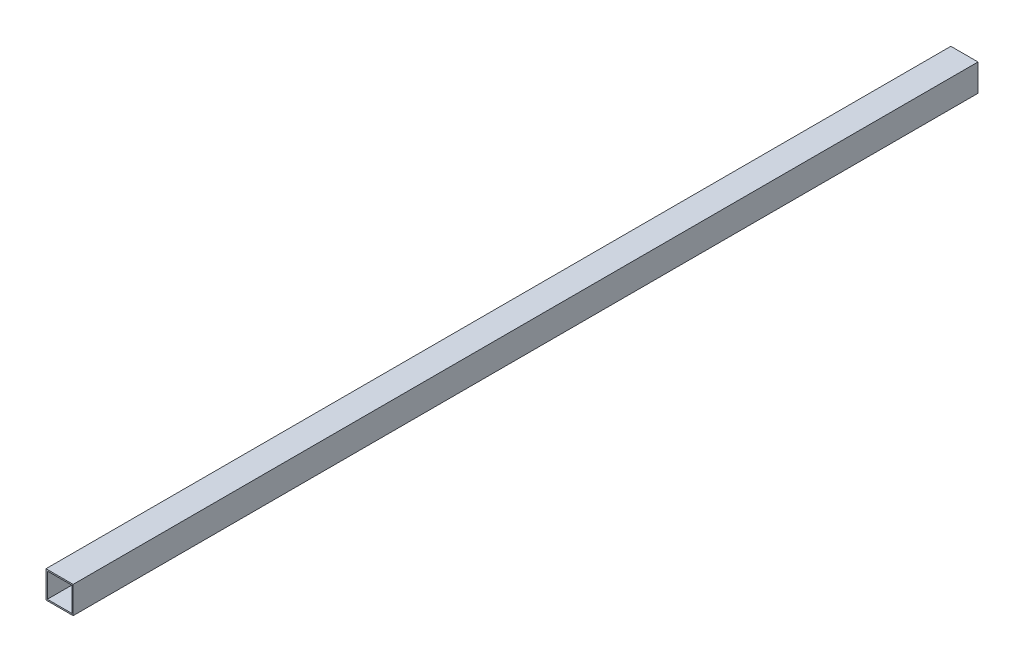
ISO-10303-21;
HEADER;
FILE_DESCRIPTION(('STEP AP214'),'2;1');
FILE_NAME('part.step','',(''),(''),'','','');
FILE_SCHEMA(('AUTOMOTIVE_DESIGN { 1 0 10303 214 1 1 1 1 }'));
ENDSEC;
DATA;
#1=APPLICATION_CONTEXT('core data for automotive mechanical design processes');
#2=APPLICATION_PROTOCOL_DEFINITION('international standard','automotive_design',2000,#1);
#3=PRODUCT_CONTEXT('',#1,'mechanical');
#4=PRODUCT('Part','Part','',(#3));
#5=PRODUCT_RELATED_PRODUCT_CATEGORY('part','',(#4));
#6=PRODUCT_DEFINITION_FORMATION('','',#4);
#7=PRODUCT_DEFINITION_CONTEXT('part definition',#1,'design');
#8=PRODUCT_DEFINITION('design','',#6,#7);
#9=PRODUCT_DEFINITION_SHAPE('','',#8);
#10=(LENGTH_UNIT() NAMED_UNIT(*) SI_UNIT(.MILLI.,.METRE.));
#11=(NAMED_UNIT(*) PLANE_ANGLE_UNIT() SI_UNIT($,.RADIAN.));
#12=(NAMED_UNIT(*) SI_UNIT($,.STERADIAN.) SOLID_ANGLE_UNIT());
#13=UNCERTAINTY_MEASURE_WITH_UNIT(LENGTH_MEASURE(1.E-05),#10,'distance_accuracy_value','');
#14=(GEOMETRIC_REPRESENTATION_CONTEXT(3) GLOBAL_UNCERTAINTY_ASSIGNED_CONTEXT((#13)) GLOBAL_UNIT_ASSIGNED_CONTEXT((#10,
#11,#12)) REPRESENTATION_CONTEXT('',''));
#15=CARTESIAN_POINT('',(0.,0.,0.));
#16=DIRECTION('',(0.,0.,1.));
#17=DIRECTION('',(1.,0.,0.));
#18=AXIS2_PLACEMENT_3D('',#15,#16,#17);
#19=CARTESIAN_POINT('',(0.,0.,1000.));
#20=DIRECTION('',(0.,0.,1.));
#21=DIRECTION('',(1.,0.,0.));
#22=AXIS2_PLACEMENT_3D('',#19,#20,#21);
#23=PLANE('',#22);
#24=DIRECTION('',(0.,1.,0.));
#25=VECTOR('',#24,1.);
#26=CARTESIAN_POINT('',(15.,15.,1000.));
#27=LINE('',#26,#25);
#28=CARTESIAN_POINT('',(15.,-15.,1000.));
#29=VERTEX_POINT('',#28);
#30=CARTESIAN_POINT('',(15.,15.,1000.));
#31=VERTEX_POINT('',#30);
#32=EDGE_CURVE('E138',#29,#31,#27,.T.);
#33=ORIENTED_EDGE('',*,*,#32,.T.);
#34=DIRECTION('',(-1.,0.,0.));
#35=VECTOR('',#34,1.);
#36=CARTESIAN_POINT('',(-15.,15.,1000.));
#37=LINE('',#36,#35);
#38=CARTESIAN_POINT('',(-15.,15.,1000.));
#39=VERTEX_POINT('',#38);
#40=EDGE_CURVE('E141',#31,#39,#37,.T.);
#41=ORIENTED_EDGE('',*,*,#40,.T.);
#42=DIRECTION('',(0.,-1.,0.));
#43=VECTOR('',#42,1.);
#44=CARTESIAN_POINT('',(-15.,15.,1000.));
#45=LINE('',#44,#43);
#46=CARTESIAN_POINT('',(-15.,-15.,1000.));
#47=VERTEX_POINT('',#46);
#48=EDGE_CURVE('E144',#39,#47,#45,.T.);
#49=ORIENTED_EDGE('',*,*,#48,.T.);
#50=DIRECTION('',(1.,0.,0.));
#51=VECTOR('',#50,1.);
#52=CARTESIAN_POINT('',(-15.,-15.,1000.));
#53=LINE('',#52,#51);
#54=EDGE_CURVE('E146',#47,#29,#53,.T.);
#55=ORIENTED_EDGE('',*,*,#54,.T.);
#56=EDGE_LOOP('',(#33,#41,#49,#55));
#57=FACE_BOUND('',#56,.T.);
#58=DIRECTION('',(0.,-1.,0.));
#59=VECTOR('',#58,1.);
#60=CARTESIAN_POINT('',(-13.5,13.5,1000.));
#61=LINE('',#60,#59);
#62=CARTESIAN_POINT('',(-13.5,13.5,1000.));
#63=VERTEX_POINT('',#62);
#64=CARTESIAN_POINT('',(-13.5,-13.5,1000.));
#65=VERTEX_POINT('',#64);
#66=EDGE_CURVE('E110',#63,#65,#61,.T.);
#67=ORIENTED_EDGE('',*,*,#66,.F.);
#68=DIRECTION('',(-1.,0.,0.));
#69=VECTOR('',#68,1.);
#70=CARTESIAN_POINT('',(-13.5,13.5,1000.));
#71=LINE('',#70,#69);
#72=CARTESIAN_POINT('',(13.5,13.5,1000.));
#73=VERTEX_POINT('',#72);
#74=EDGE_CURVE('E102',#73,#63,#71,.T.);
#75=ORIENTED_EDGE('',*,*,#74,.F.);
#76=DIRECTION('',(0.,1.,0.));
#77=VECTOR('',#76,1.);
#78=CARTESIAN_POINT('',(13.5,13.5,1000.));
#79=LINE('',#78,#77);
#80=CARTESIAN_POINT('',(13.5,-13.5,1000.));
#81=VERTEX_POINT('',#80);
#82=EDGE_CURVE('E124',#81,#73,#79,.T.);
#83=ORIENTED_EDGE('',*,*,#82,.F.);
#84=DIRECTION('',(1.,0.,0.));
#85=VECTOR('',#84,1.);
#86=CARTESIAN_POINT('',(-13.5,-13.5,1000.));
#87=LINE('',#86,#85);
#88=EDGE_CURVE('E122',#65,#81,#87,.T.);
#89=ORIENTED_EDGE('',*,*,#88,.F.);
#90=EDGE_LOOP('',(#67,#75,#83,#89));
#91=FACE_BOUND('',#90,.T.);
#92=ADVANCED_FACE('F37',(#57,#91),#23,.T.);
#93=CARTESIAN_POINT('',(0.,0.,0.));
#94=DIRECTION('',(0.,0.,1.));
#95=DIRECTION('',(1.,0.,0.));
#96=AXIS2_PLACEMENT_3D('',#93,#94,#95);
#97=PLANE('',#96);
#98=DIRECTION('',(0.,1.,0.));
#99=VECTOR('',#98,1.);
#100=CARTESIAN_POINT('',(15.,15.,0.));
#101=LINE('',#100,#99);
#102=CARTESIAN_POINT('',(15.,-15.,0.));
#103=VERTEX_POINT('',#102);
#104=CARTESIAN_POINT('',(15.,15.,0.));
#105=VERTEX_POINT('',#104);
#106=EDGE_CURVE('E118',#103,#105,#101,.T.);
#107=ORIENTED_EDGE('',*,*,#106,.F.);
#108=DIRECTION('',(1.,0.,0.));
#109=VECTOR('',#108,1.);
#110=CARTESIAN_POINT('',(-15.,-15.,0.));
#111=LINE('',#110,#109);
#112=CARTESIAN_POINT('',(-15.,-15.,0.));
#113=VERTEX_POINT('',#112);
#114=EDGE_CURVE('E142',#113,#103,#111,.T.);
#115=ORIENTED_EDGE('',*,*,#114,.F.);
#116=DIRECTION('',(0.,-1.,0.));
#117=VECTOR('',#116,1.);
#118=CARTESIAN_POINT('',(-15.,15.,0.));
#119=LINE('',#118,#117);
#120=CARTESIAN_POINT('',(-15.,15.,0.));
#121=VERTEX_POINT('',#120);
#122=EDGE_CURVE('E153',#121,#113,#119,.T.);
#123=ORIENTED_EDGE('',*,*,#122,.F.);
#124=DIRECTION('',(-1.,0.,0.));
#125=VECTOR('',#124,1.);
#126=CARTESIAN_POINT('',(-15.,15.,0.));
#127=LINE('',#126,#125);
#128=EDGE_CURVE('E151',#105,#121,#127,.T.);
#129=ORIENTED_EDGE('',*,*,#128,.F.);
#130=EDGE_LOOP('',(#107,#115,#123,#129));
#131=FACE_BOUND('',#130,.T.);
#132=DIRECTION('',(-1.,0.,0.));
#133=VECTOR('',#132,1.);
#134=CARTESIAN_POINT('',(-13.5,13.5,0.));
#135=LINE('',#134,#133);
#136=CARTESIAN_POINT('',(13.5,13.5,0.));
#137=VERTEX_POINT('',#136);
#138=CARTESIAN_POINT('',(-13.5,13.5,0.));
#139=VERTEX_POINT('',#138);
#140=EDGE_CURVE('E60',#137,#139,#135,.T.);
#141=ORIENTED_EDGE('',*,*,#140,.T.);
#142=DIRECTION('',(0.,-1.,0.));
#143=VECTOR('',#142,1.);
#144=CARTESIAN_POINT('',(-13.5,13.5,0.));
#145=LINE('',#144,#143);
#146=CARTESIAN_POINT('',(-13.5,-13.5,0.));
#147=VERTEX_POINT('',#146);
#148=EDGE_CURVE('E117',#139,#147,#145,.T.);
#149=ORIENTED_EDGE('',*,*,#148,.T.);
#150=DIRECTION('',(1.,0.,0.));
#151=VECTOR('',#150,1.);
#152=CARTESIAN_POINT('',(-13.5,-13.5,0.));
#153=LINE('',#152,#151);
#154=CARTESIAN_POINT('',(13.5,-13.5,0.));
#155=VERTEX_POINT('',#154);
#156=EDGE_CURVE('E130',#147,#155,#153,.T.);
#157=ORIENTED_EDGE('',*,*,#156,.T.);
#158=DIRECTION('',(0.,1.,0.));
#159=VECTOR('',#158,1.);
#160=CARTESIAN_POINT('',(13.5,13.5,0.));
#161=LINE('',#160,#159);
#162=EDGE_CURVE('E111',#155,#137,#161,.T.);
#163=ORIENTED_EDGE('',*,*,#162,.T.);
#164=EDGE_LOOP('',(#141,#149,#157,#163));
#165=FACE_BOUND('',#164,.T.);
#166=ADVANCED_FACE('F171',(#131,#165),#97,.F.);
#167=CARTESIAN_POINT('',(15.,15.,1000.));
#168=DIRECTION('',(-1.,0.,0.));
#169=DIRECTION('',(0.,-1.,0.));
#170=AXIS2_PLACEMENT_3D('',#167,#168,#169);
#171=PLANE('',#170);
#172=ORIENTED_EDGE('',*,*,#106,.T.);
#173=DIRECTION('',(0.,0.,-1.));
#174=VECTOR('',#173,1.);
#175=CARTESIAN_POINT('',(15.,15.,1000.));
#176=LINE('',#175,#174);
#177=EDGE_CURVE('E11',#31,#105,#176,.T.);
#178=ORIENTED_EDGE('',*,*,#177,.F.);
#179=ORIENTED_EDGE('',*,*,#32,.F.);
#180=DIRECTION('',(0.,0.,-1.));
#181=VECTOR('',#180,1.);
#182=CARTESIAN_POINT('',(15.,-15.,1000.));
#183=LINE('',#182,#181);
#184=EDGE_CURVE('E148',#29,#103,#183,.T.);
#185=ORIENTED_EDGE('',*,*,#184,.T.);
#186=EDGE_LOOP('',(#172,#178,#179,#185));
#187=FACE_BOUND('',#186,.T.);
#188=ADVANCED_FACE('F39',(#187),#171,.F.);
#189=CARTESIAN_POINT('',(-15.,15.,1000.));
#190=DIRECTION('',(0.,-1.,0.));
#191=DIRECTION('',(0.,0.,-1.));
#192=AXIS2_PLACEMENT_3D('',#189,#190,#191);
#193=PLANE('',#192);
#194=ORIENTED_EDGE('',*,*,#128,.T.);
#195=DIRECTION('',(0.,0.,-1.));
#196=VECTOR('',#195,1.);
#197=CARTESIAN_POINT('',(-15.,15.,1000.));
#198=LINE('',#197,#196);
#199=EDGE_CURVE('E45',#39,#121,#198,.T.);
#200=ORIENTED_EDGE('',*,*,#199,.F.);
#201=ORIENTED_EDGE('',*,*,#40,.F.);
#202=ORIENTED_EDGE('',*,*,#177,.T.);
#203=EDGE_LOOP('',(#194,#200,#201,#202));
#204=FACE_BOUND('',#203,.T.);
#205=ADVANCED_FACE('F181',(#204),#193,.F.);
#206=CARTESIAN_POINT('',(-15.,15.,1000.));
#207=DIRECTION('',(1.,0.,0.));
#208=DIRECTION('',(0.,1.,0.));
#209=AXIS2_PLACEMENT_3D('',#206,#207,#208);
#210=PLANE('',#209);
#211=ORIENTED_EDGE('',*,*,#122,.T.);
#212=DIRECTION('',(0.,0.,-1.));
#213=VECTOR('',#212,1.);
#214=CARTESIAN_POINT('',(-15.,-15.,1000.));
#215=LINE('',#214,#213);
#216=EDGE_CURVE('E158',#47,#113,#215,.T.);
#217=ORIENTED_EDGE('',*,*,#216,.F.);
#218=ORIENTED_EDGE('',*,*,#48,.F.);
#219=ORIENTED_EDGE('',*,*,#199,.T.);
#220=EDGE_LOOP('',(#211,#217,#218,#219));
#221=FACE_BOUND('',#220,.T.);
#222=ADVANCED_FACE('F165',(#221),#210,.F.);
#223=CARTESIAN_POINT('',(-15.,-15.,1000.));
#224=DIRECTION('',(0.,1.,0.));
#225=DIRECTION('',(0.,0.,1.));
#226=AXIS2_PLACEMENT_3D('',#223,#224,#225);
#227=PLANE('',#226);
#228=ORIENTED_EDGE('',*,*,#114,.T.);
#229=ORIENTED_EDGE('',*,*,#184,.F.);
#230=ORIENTED_EDGE('',*,*,#54,.F.);
#231=ORIENTED_EDGE('',*,*,#216,.T.);
#232=EDGE_LOOP('',(#228,#229,#230,#231));
#233=FACE_BOUND('',#232,.T.);
#234=ADVANCED_FACE('F175',(#233),#227,.F.);
#235=CARTESIAN_POINT('',(-13.5,13.5,1000.));
#236=DIRECTION('',(0.,-1.,0.));
#237=DIRECTION('',(0.,0.,-1.));
#238=AXIS2_PLACEMENT_3D('',#235,#236,#237);
#239=PLANE('',#238);
#240=ORIENTED_EDGE('',*,*,#140,.F.);
#241=DIRECTION('',(0.,0.,-1.));
#242=VECTOR('',#241,1.);
#243=CARTESIAN_POINT('',(13.5,13.5,1000.));
#244=LINE('',#243,#242);
#245=EDGE_CURVE('E106',#73,#137,#244,.T.);
#246=ORIENTED_EDGE('',*,*,#245,.F.);
#247=ORIENTED_EDGE('',*,*,#74,.T.);
#248=DIRECTION('',(0.,0.,-1.));
#249=VECTOR('',#248,1.);
#250=CARTESIAN_POINT('',(-13.5,13.5,1000.));
#251=LINE('',#250,#249);
#252=EDGE_CURVE('E105',#63,#139,#251,.T.);
#253=ORIENTED_EDGE('',*,*,#252,.T.);
#254=EDGE_LOOP('',(#240,#246,#247,#253));
#255=FACE_BOUND('',#254,.T.);
#256=ADVANCED_FACE('F104',(#255),#239,.T.);
#257=CARTESIAN_POINT('',(-13.5,13.5,1000.));
#258=DIRECTION('',(1.,0.,0.));
#259=DIRECTION('',(0.,1.,0.));
#260=AXIS2_PLACEMENT_3D('',#257,#258,#259);
#261=PLANE('',#260);
#262=ORIENTED_EDGE('',*,*,#148,.F.);
#263=ORIENTED_EDGE('',*,*,#252,.F.);
#264=ORIENTED_EDGE('',*,*,#66,.T.);
#265=DIRECTION('',(0.,0.,-1.));
#266=VECTOR('',#265,1.);
#267=CARTESIAN_POINT('',(-13.5,-13.5,1000.));
#268=LINE('',#267,#266);
#269=EDGE_CURVE('E119',#65,#147,#268,.T.);
#270=ORIENTED_EDGE('',*,*,#269,.T.);
#271=EDGE_LOOP('',(#262,#263,#264,#270));
#272=FACE_BOUND('',#271,.T.);
#273=ADVANCED_FACE('F114',(#272),#261,.T.);
#274=CARTESIAN_POINT('',(-13.5,-13.5,1000.));
#275=DIRECTION('',(0.,1.,0.));
#276=DIRECTION('',(0.,0.,1.));
#277=AXIS2_PLACEMENT_3D('',#274,#275,#276);
#278=PLANE('',#277);
#279=ORIENTED_EDGE('',*,*,#156,.F.);
#280=ORIENTED_EDGE('',*,*,#269,.F.);
#281=ORIENTED_EDGE('',*,*,#88,.T.);
#282=DIRECTION('',(0.,0.,-1.));
#283=VECTOR('',#282,1.);
#284=CARTESIAN_POINT('',(13.5,-13.5,1000.));
#285=LINE('',#284,#283);
#286=EDGE_CURVE('E52',#81,#155,#285,.T.);
#287=ORIENTED_EDGE('',*,*,#286,.T.);
#288=EDGE_LOOP('',(#279,#280,#281,#287));
#289=FACE_BOUND('',#288,.T.);
#290=ADVANCED_FACE('F204',(#289),#278,.T.);
#291=CARTESIAN_POINT('',(13.5,13.5,1000.));
#292=DIRECTION('',(-1.,0.,0.));
#293=DIRECTION('',(0.,-1.,0.));
#294=AXIS2_PLACEMENT_3D('',#291,#292,#293);
#295=PLANE('',#294);
#296=ORIENTED_EDGE('',*,*,#162,.F.);
#297=ORIENTED_EDGE('',*,*,#286,.F.);
#298=ORIENTED_EDGE('',*,*,#82,.T.);
#299=ORIENTED_EDGE('',*,*,#245,.T.);
#300=EDGE_LOOP('',(#296,#297,#298,#299));
#301=FACE_BOUND('',#300,.T.);
#302=ADVANCED_FACE('F208',(#301),#295,.T.);
#303=CLOSED_SHELL('',(#92,#166,#188,#205,#222,#234,#256,#273,#290,#302));
#304=MANIFOLD_SOLID_BREP('B2',#303);
#305=ADVANCED_BREP_SHAPE_REPRESENTATION('',(#18,#304),#14);
#306=SHAPE_DEFINITION_REPRESENTATION(#9,#305);
ENDSEC;
END-ISO-10303-21;
